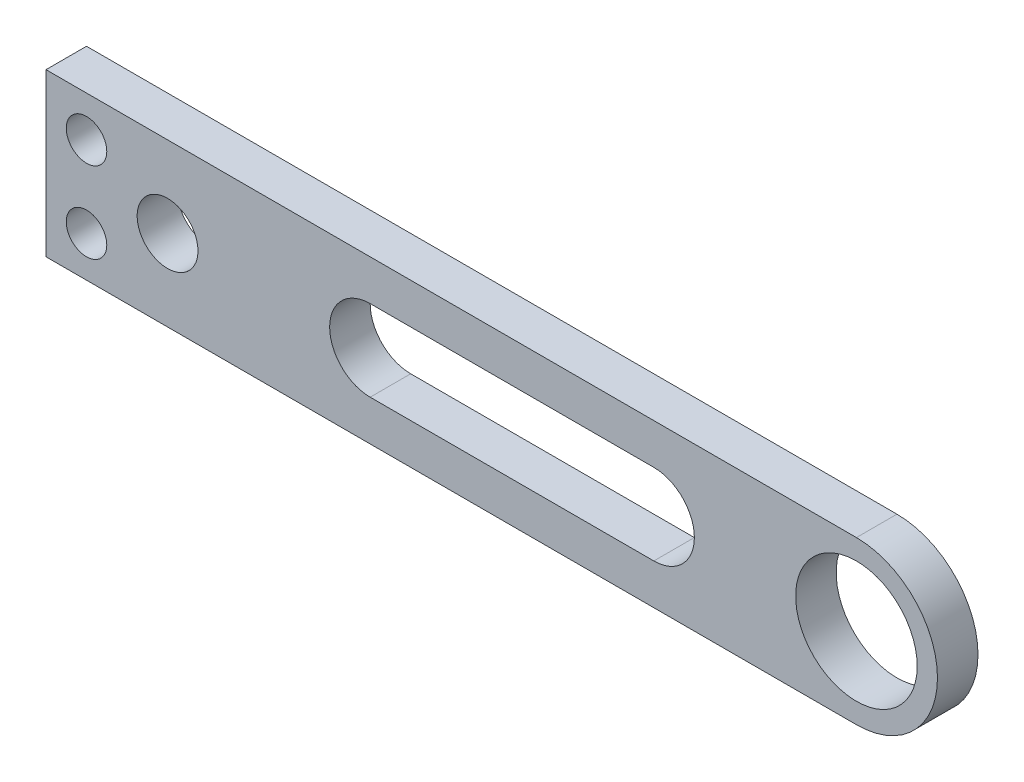
ISO-10303-21;
HEADER;
FILE_DESCRIPTION(('STEP AP214'),'2;1');
FILE_NAME('part.step','',(''),(''),'','','');
FILE_SCHEMA(('AUTOMOTIVE_DESIGN { 1 0 10303 214 1 1 1 1 }'));
ENDSEC;
DATA;
#1=APPLICATION_CONTEXT('core data for automotive mechanical design processes');
#2=APPLICATION_PROTOCOL_DEFINITION('international standard','automotive_design',2000,#1);
#3=PRODUCT_CONTEXT('',#1,'mechanical');
#4=PRODUCT('Part','Part','',(#3));
#5=PRODUCT_RELATED_PRODUCT_CATEGORY('part','',(#4));
#6=PRODUCT_DEFINITION_FORMATION('','',#4);
#7=PRODUCT_DEFINITION_CONTEXT('part definition',#1,'design');
#8=PRODUCT_DEFINITION('design','',#6,#7);
#9=PRODUCT_DEFINITION_SHAPE('','',#8);
#10=(LENGTH_UNIT() NAMED_UNIT(*) SI_UNIT(.MILLI.,.METRE.));
#11=(NAMED_UNIT(*) PLANE_ANGLE_UNIT() SI_UNIT($,.RADIAN.));
#12=(NAMED_UNIT(*) SI_UNIT($,.STERADIAN.) SOLID_ANGLE_UNIT());
#13=UNCERTAINTY_MEASURE_WITH_UNIT(LENGTH_MEASURE(1.E-05),#10,'distance_accuracy_value','');
#14=(GEOMETRIC_REPRESENTATION_CONTEXT(3) GLOBAL_UNCERTAINTY_ASSIGNED_CONTEXT((#13)) GLOBAL_UNIT_ASSIGNED_CONTEXT((#10,
#11,#12)) REPRESENTATION_CONTEXT('',''));
#15=CARTESIAN_POINT('',(0.,0.,0.));
#16=DIRECTION('',(0.,0.,1.));
#17=DIRECTION('',(1.,0.,0.));
#18=AXIS2_PLACEMENT_3D('',#15,#16,#17);
#19=CARTESIAN_POINT('',(34.,0.,2.));
#20=DIRECTION('',(0.,0.,1.));
#21=DIRECTION('',(1.,0.,0.));
#22=AXIS2_PLACEMENT_3D('',#19,#20,#21);
#23=PLANE('',#22);
#24=CARTESIAN_POINT('',(-4.,2.,2.));
#25=DIRECTION('',(0.,0.,1.));
#26=DIRECTION('',(1.,0.,0.));
#27=AXIS2_PLACEMENT_3D('',#24,#25,#26);
#28=CIRCLE('',#27,1.);
#29=CARTESIAN_POINT('',(-3.,2.,2.));
#30=VERTEX_POINT('',#29);
#31=EDGE_CURVE('E127',#30,#30,#28,.T.);
#32=ORIENTED_EDGE('',*,*,#31,.F.);
#33=EDGE_LOOP('',(#32));
#34=FACE_BOUND('',#33,.T.);
#35=CARTESIAN_POINT('',(0.,0.,2.));
#36=DIRECTION('',(0.,0.,1.));
#37=DIRECTION('',(1.,0.,0.));
#38=AXIS2_PLACEMENT_3D('',#35,#36,#37);
#39=CIRCLE('',#38,1.5);
#40=CARTESIAN_POINT('',(1.5,0.,2.));
#41=VERTEX_POINT('',#40);
#42=EDGE_CURVE('E143',#41,#41,#39,.T.);
#43=ORIENTED_EDGE('',*,*,#42,.F.);
#44=EDGE_LOOP('',(#43));
#45=FACE_BOUND('',#44,.T.);
#46=DIRECTION('',(-1.,0.,0.));
#47=VECTOR('',#46,1.);
#48=CARTESIAN_POINT('',(0.,4.,2.));
#49=LINE('',#48,#47);
#50=CARTESIAN_POINT('',(34.,4.,2.));
#51=VERTEX_POINT('',#50);
#52=CARTESIAN_POINT('',(-6.,4.,2.));
#53=VERTEX_POINT('',#52);
#54=EDGE_CURVE('E149',#51,#53,#49,.T.);
#55=ORIENTED_EDGE('',*,*,#54,.T.);
#56=DIRECTION('',(0.,-1.,0.));
#57=VECTOR('',#56,1.);
#58=CARTESIAN_POINT('',(-6.,4.,2.));
#59=LINE('',#58,#57);
#60=CARTESIAN_POINT('',(-6.,-4.,2.));
#61=VERTEX_POINT('',#60);
#62=EDGE_CURVE('E152',#53,#61,#59,.T.);
#63=ORIENTED_EDGE('',*,*,#62,.T.);
#64=DIRECTION('',(1.,0.,0.));
#65=VECTOR('',#64,1.);
#66=CARTESIAN_POINT('',(-6.,-4.,2.));
#67=LINE('',#66,#65);
#68=CARTESIAN_POINT('',(34.,-4.,2.));
#69=VERTEX_POINT('',#68);
#70=EDGE_CURVE('E155',#61,#69,#67,.T.);
#71=ORIENTED_EDGE('',*,*,#70,.T.);
#72=CARTESIAN_POINT('',(34.,0.,2.));
#73=DIRECTION('',(0.,0.,1.));
#74=DIRECTION('',(1.,0.,0.));
#75=AXIS2_PLACEMENT_3D('',#72,#73,#74);
#76=CIRCLE('',#75,4.);
#77=EDGE_CURVE('E157',#69,#51,#76,.T.);
#78=ORIENTED_EDGE('',*,*,#77,.T.);
#79=EDGE_LOOP('',(#55,#63,#71,#78));
#80=FACE_BOUND('',#79,.T.);
#81=CARTESIAN_POINT('',(34.,0.,2.));
#82=DIRECTION('',(0.,0.,1.));
#83=DIRECTION('',(1.,0.,0.));
#84=AXIS2_PLACEMENT_3D('',#81,#82,#83);
#85=CIRCLE('',#84,2.99999999999999);
#86=CARTESIAN_POINT('',(37.,0.,2.));
#87=VERTEX_POINT('',#86);
#88=EDGE_CURVE('E137',#87,#87,#85,.T.);
#89=ORIENTED_EDGE('',*,*,#88,.F.);
#90=EDGE_LOOP('',(#89));
#91=FACE_BOUND('',#90,.T.);
#92=DIRECTION('',(1.,0.,0.));
#93=VECTOR('',#92,1.);
#94=CARTESIAN_POINT('',(10.,-2.,2.));
#95=LINE('',#94,#93);
#96=CARTESIAN_POINT('',(10.,-2.,2.));
#97=VERTEX_POINT('',#96);
#98=CARTESIAN_POINT('',(24.,-2.,2.));
#99=VERTEX_POINT('',#98);
#100=EDGE_CURVE('E106',#97,#99,#95,.T.);
#101=ORIENTED_EDGE('',*,*,#100,.F.);
#102=CARTESIAN_POINT('',(10.,0.,2.));
#103=DIRECTION('',(0.,0.,1.));
#104=DIRECTION('',(1.,0.,0.));
#105=AXIS2_PLACEMENT_3D('',#102,#103,#104);
#106=CIRCLE('',#105,2.);
#107=CARTESIAN_POINT('',(10.,2.,2.));
#108=VERTEX_POINT('',#107);
#109=EDGE_CURVE('E98',#108,#97,#106,.T.);
#110=ORIENTED_EDGE('',*,*,#109,.F.);
#111=DIRECTION('',(-1.,0.,0.));
#112=VECTOR('',#111,1.);
#113=CARTESIAN_POINT('',(10.,2.,2.));
#114=LINE('',#113,#112);
#115=CARTESIAN_POINT('',(24.,2.,2.));
#116=VERTEX_POINT('',#115);
#117=EDGE_CURVE('E121',#116,#108,#114,.T.);
#118=ORIENTED_EDGE('',*,*,#117,.F.);
#119=CARTESIAN_POINT('',(24.,0.,2.));
#120=DIRECTION('',(0.,0.,1.));
#121=DIRECTION('',(1.,0.,0.));
#122=AXIS2_PLACEMENT_3D('',#119,#120,#121);
#123=CIRCLE('',#122,2.);
#124=EDGE_CURVE('E119',#99,#116,#123,.T.);
#125=ORIENTED_EDGE('',*,*,#124,.F.);
#126=EDGE_LOOP('',(#101,#110,#118,#125));
#127=FACE_BOUND('',#126,.T.);
#128=CARTESIAN_POINT('',(-4.,-2.,2.));
#129=DIRECTION('',(0.,0.,1.));
#130=DIRECTION('',(1.,0.,0.));
#131=AXIS2_PLACEMENT_3D('',#128,#129,#130);
#132=CIRCLE('',#131,1.);
#133=CARTESIAN_POINT('',(-3.,-2.,2.));
#134=VERTEX_POINT('',#133);
#135=EDGE_CURVE('E330',#134,#134,#132,.T.);
#136=ORIENTED_EDGE('',*,*,#135,.F.);
#137=EDGE_LOOP('',(#136));
#138=FACE_BOUND('',#137,.T.);
#139=ADVANCED_FACE('F33',(#34,#45,#80,#91,#127,#138),#23,.T.);
#140=CARTESIAN_POINT('',(34.,0.,0.));
#141=DIRECTION('',(0.,0.,1.));
#142=DIRECTION('',(1.,0.,0.));
#143=AXIS2_PLACEMENT_3D('',#140,#141,#142);
#144=PLANE('',#143);
#145=CARTESIAN_POINT('',(34.,0.,0.));
#146=DIRECTION('',(0.,0.,1.));
#147=DIRECTION('',(1.,0.,0.));
#148=AXIS2_PLACEMENT_3D('',#145,#146,#147);
#149=CIRCLE('',#148,2.99999999999999);
#150=CARTESIAN_POINT('',(37.,0.,0.));
#151=VERTEX_POINT('',#150);
#152=EDGE_CURVE('E114',#151,#151,#149,.T.);
#153=ORIENTED_EDGE('',*,*,#152,.T.);
#154=EDGE_LOOP('',(#153));
#155=FACE_BOUND('',#154,.T.);
#156=CARTESIAN_POINT('',(0.,0.,0.));
#157=DIRECTION('',(0.,0.,1.));
#158=DIRECTION('',(1.,0.,0.));
#159=AXIS2_PLACEMENT_3D('',#156,#157,#158);
#160=CIRCLE('',#159,1.5);
#161=CARTESIAN_POINT('',(1.5,0.,0.));
#162=VERTEX_POINT('',#161);
#163=EDGE_CURVE('E140',#162,#162,#160,.T.);
#164=ORIENTED_EDGE('',*,*,#163,.T.);
#165=EDGE_LOOP('',(#164));
#166=FACE_BOUND('',#165,.T.);
#167=DIRECTION('',(0.,-1.,0.));
#168=VECTOR('',#167,1.);
#169=CARTESIAN_POINT('',(-6.,4.,0.));
#170=LINE('',#169,#168);
#171=CARTESIAN_POINT('',(-6.,4.,0.));
#172=VERTEX_POINT('',#171);
#173=CARTESIAN_POINT('',(-6.,-4.,0.));
#174=VERTEX_POINT('',#173);
#175=EDGE_CURVE('E146',#172,#174,#170,.T.);
#176=ORIENTED_EDGE('',*,*,#175,.F.);
#177=DIRECTION('',(-1.,0.,0.));
#178=VECTOR('',#177,1.);
#179=CARTESIAN_POINT('',(0.,4.,0.));
#180=LINE('',#179,#178);
#181=CARTESIAN_POINT('',(34.,4.,0.));
#182=VERTEX_POINT('',#181);
#183=EDGE_CURVE('E153',#182,#172,#180,.T.);
#184=ORIENTED_EDGE('',*,*,#183,.F.);
#185=CARTESIAN_POINT('',(34.,0.,0.));
#186=DIRECTION('',(0.,0.,1.));
#187=DIRECTION('',(1.,0.,0.));
#188=AXIS2_PLACEMENT_3D('',#185,#186,#187);
#189=CIRCLE('',#188,4.);
#190=CARTESIAN_POINT('',(34.,-4.,0.));
#191=VERTEX_POINT('',#190);
#192=EDGE_CURVE('E165',#191,#182,#189,.T.);
#193=ORIENTED_EDGE('',*,*,#192,.F.);
#194=DIRECTION('',(1.,0.,0.));
#195=VECTOR('',#194,1.);
#196=CARTESIAN_POINT('',(0.,-4.,0.));
#197=LINE('',#196,#195);
#198=EDGE_CURVE('E163',#174,#191,#197,.T.);
#199=ORIENTED_EDGE('',*,*,#198,.F.);
#200=EDGE_LOOP('',(#176,#184,#193,#199));
#201=FACE_BOUND('',#200,.T.);
#202=CARTESIAN_POINT('',(10.,0.,0.));
#203=DIRECTION('',(0.,0.,1.));
#204=DIRECTION('',(1.,0.,0.));
#205=AXIS2_PLACEMENT_3D('',#202,#203,#204);
#206=CIRCLE('',#205,2.);
#207=CARTESIAN_POINT('',(10.,2.,0.));
#208=VERTEX_POINT('',#207);
#209=CARTESIAN_POINT('',(10.,-2.,0.));
#210=VERTEX_POINT('',#209);
#211=EDGE_CURVE('E56',#208,#210,#206,.T.);
#212=ORIENTED_EDGE('',*,*,#211,.T.);
#213=DIRECTION('',(1.,0.,0.));
#214=VECTOR('',#213,1.);
#215=CARTESIAN_POINT('',(10.,-2.,0.));
#216=LINE('',#215,#214);
#217=CARTESIAN_POINT('',(24.,-2.,0.));
#218=VERTEX_POINT('',#217);
#219=EDGE_CURVE('E113',#210,#218,#216,.T.);
#220=ORIENTED_EDGE('',*,*,#219,.T.);
#221=CARTESIAN_POINT('',(24.,0.,0.));
#222=DIRECTION('',(0.,0.,1.));
#223=DIRECTION('',(1.,0.,0.));
#224=AXIS2_PLACEMENT_3D('',#221,#222,#223);
#225=CIRCLE('',#224,2.);
#226=CARTESIAN_POINT('',(24.,2.,0.));
#227=VERTEX_POINT('',#226);
#228=EDGE_CURVE('E129',#218,#227,#225,.T.);
#229=ORIENTED_EDGE('',*,*,#228,.T.);
#230=DIRECTION('',(-1.,0.,0.));
#231=VECTOR('',#230,1.);
#232=CARTESIAN_POINT('',(10.,2.,0.));
#233=LINE('',#232,#231);
#234=EDGE_CURVE('E107',#227,#208,#233,.T.);
#235=ORIENTED_EDGE('',*,*,#234,.T.);
#236=EDGE_LOOP('',(#212,#220,#229,#235));
#237=FACE_BOUND('',#236,.T.);
#238=CARTESIAN_POINT('',(-4.,2.,0.));
#239=DIRECTION('',(0.,0.,1.));
#240=DIRECTION('',(1.,0.,0.));
#241=AXIS2_PLACEMENT_3D('',#238,#239,#240);
#242=CIRCLE('',#241,1.);
#243=CARTESIAN_POINT('',(-3.,2.,0.));
#244=VERTEX_POINT('',#243);
#245=EDGE_CURVE('E336',#244,#244,#242,.T.);
#246=ORIENTED_EDGE('',*,*,#245,.T.);
#247=EDGE_LOOP('',(#246));
#248=FACE_BOUND('',#247,.T.);
#249=CARTESIAN_POINT('',(-4.,-2.,0.));
#250=DIRECTION('',(0.,0.,1.));
#251=DIRECTION('',(1.,0.,0.));
#252=AXIS2_PLACEMENT_3D('',#249,#250,#251);
#253=CIRCLE('',#252,1.);
#254=CARTESIAN_POINT('',(-3.,-2.,0.));
#255=VERTEX_POINT('',#254);
#256=EDGE_CURVE('E333',#255,#255,#253,.T.);
#257=ORIENTED_EDGE('',*,*,#256,.T.);
#258=EDGE_LOOP('',(#257));
#259=FACE_BOUND('',#258,.T.);
#260=ADVANCED_FACE('F183',(#155,#166,#201,#237,#248,#259),#144,.F.);
#261=CARTESIAN_POINT('',(-6.,4.,2.));
#262=DIRECTION('',(1.,0.,0.));
#263=DIRECTION('',(0.,1.,0.));
#264=AXIS2_PLACEMENT_3D('',#261,#262,#263);
#265=PLANE('',#264);
#266=ORIENTED_EDGE('',*,*,#175,.T.);
#267=DIRECTION('',(0.,0.,-1.));
#268=VECTOR('',#267,1.);
#269=CARTESIAN_POINT('',(-6.,-4.,2.));
#270=LINE('',#269,#268);
#271=EDGE_CURVE('E41',#61,#174,#270,.T.);
#272=ORIENTED_EDGE('',*,*,#271,.F.);
#273=ORIENTED_EDGE('',*,*,#62,.F.);
#274=DIRECTION('',(0.,0.,-1.));
#275=VECTOR('',#274,1.);
#276=CARTESIAN_POINT('',(-6.,4.,2.));
#277=LINE('',#276,#275);
#278=EDGE_CURVE('E11',#53,#172,#277,.T.);
#279=ORIENTED_EDGE('',*,*,#278,.T.);
#280=EDGE_LOOP('',(#266,#272,#273,#279));
#281=FACE_BOUND('',#280,.T.);
#282=ADVANCED_FACE('F35',(#281),#265,.F.);
#283=CARTESIAN_POINT('',(0.,-4.,2.));
#284=DIRECTION('',(0.,1.,0.));
#285=DIRECTION('',(0.,0.,1.));
#286=AXIS2_PLACEMENT_3D('',#283,#284,#285);
#287=PLANE('',#286);
#288=ORIENTED_EDGE('',*,*,#198,.T.);
#289=DIRECTION('',(0.,0.,-1.));
#290=VECTOR('',#289,1.);
#291=CARTESIAN_POINT('',(34.,-4.,2.));
#292=LINE('',#291,#290);
#293=EDGE_CURVE('E170',#69,#191,#292,.T.);
#294=ORIENTED_EDGE('',*,*,#293,.F.);
#295=ORIENTED_EDGE('',*,*,#70,.F.);
#296=ORIENTED_EDGE('',*,*,#271,.T.);
#297=EDGE_LOOP('',(#288,#294,#295,#296));
#298=FACE_BOUND('',#297,.T.);
#299=ADVANCED_FACE('F176',(#298),#287,.F.);
#300=CARTESIAN_POINT('',(34.,0.,2.));
#301=DIRECTION('',(0.,0.,-1.));
#302=DIRECTION('',(-1.,0.,0.));
#303=AXIS2_PLACEMENT_3D('',#300,#301,#302);
#304=CYLINDRICAL_SURFACE('',#303,4.);
#305=ORIENTED_EDGE('',*,*,#192,.T.);
#306=DIRECTION('',(0.,0.,-1.));
#307=VECTOR('',#306,1.);
#308=CARTESIAN_POINT('',(34.,4.,2.));
#309=LINE('',#308,#307);
#310=EDGE_CURVE('E160',#51,#182,#309,.T.);
#311=ORIENTED_EDGE('',*,*,#310,.F.);
#312=ORIENTED_EDGE('',*,*,#77,.F.);
#313=ORIENTED_EDGE('',*,*,#293,.T.);
#314=EDGE_LOOP('',(#305,#311,#312,#313));
#315=FACE_BOUND('',#314,.T.);
#316=ADVANCED_FACE('F188',(#315),#304,.T.);
#317=CARTESIAN_POINT('',(0.,4.,2.));
#318=DIRECTION('',(0.,-1.,0.));
#319=DIRECTION('',(0.,0.,-1.));
#320=AXIS2_PLACEMENT_3D('',#317,#318,#319);
#321=PLANE('',#320);
#322=ORIENTED_EDGE('',*,*,#183,.T.);
#323=ORIENTED_EDGE('',*,*,#278,.F.);
#324=ORIENTED_EDGE('',*,*,#54,.F.);
#325=ORIENTED_EDGE('',*,*,#310,.T.);
#326=EDGE_LOOP('',(#322,#323,#324,#325));
#327=FACE_BOUND('',#326,.T.);
#328=ADVANCED_FACE('F191',(#327),#321,.F.);
#329=CARTESIAN_POINT('',(0.,0.,2.));
#330=DIRECTION('',(0.,0.,-1.));
#331=DIRECTION('',(-1.,0.,0.));
#332=AXIS2_PLACEMENT_3D('',#329,#330,#331);
#333=CYLINDRICAL_SURFACE('',#332,1.5);
#334=ORIENTED_EDGE('',*,*,#42,.T.);
#335=EDGE_LOOP('',(#334));
#336=FACE_BOUND('',#335,.T.);
#337=ORIENTED_EDGE('',*,*,#163,.F.);
#338=EDGE_LOOP('',(#337));
#339=FACE_BOUND('',#338,.T.);
#340=ADVANCED_FACE('F202',(#336,#339),#333,.F.);
#341=CARTESIAN_POINT('',(34.,0.,2.));
#342=DIRECTION('',(0.,0.,-1.));
#343=DIRECTION('',(-1.,0.,0.));
#344=AXIS2_PLACEMENT_3D('',#341,#342,#343);
#345=CYLINDRICAL_SURFACE('',#344,2.99999999999999);
#346=ORIENTED_EDGE('',*,*,#88,.T.);
#347=EDGE_LOOP('',(#346));
#348=FACE_BOUND('',#347,.T.);
#349=ORIENTED_EDGE('',*,*,#152,.F.);
#350=EDGE_LOOP('',(#349));
#351=FACE_BOUND('',#350,.T.);
#352=ADVANCED_FACE('F199',(#348,#351),#345,.F.);
#353=CARTESIAN_POINT('',(10.,0.,2.));
#354=DIRECTION('',(0.,0.,-1.));
#355=DIRECTION('',(-1.,0.,0.));
#356=AXIS2_PLACEMENT_3D('',#353,#354,#355);
#357=CYLINDRICAL_SURFACE('',#356,2.);
#358=ORIENTED_EDGE('',*,*,#211,.F.);
#359=DIRECTION('',(0.,0.,-1.));
#360=VECTOR('',#359,1.);
#361=CARTESIAN_POINT('',(10.,2.,2.));
#362=LINE('',#361,#360);
#363=EDGE_CURVE('E102',#108,#208,#362,.T.);
#364=ORIENTED_EDGE('',*,*,#363,.F.);
#365=ORIENTED_EDGE('',*,*,#109,.T.);
#366=DIRECTION('',(0.,0.,-1.));
#367=VECTOR('',#366,1.);
#368=CARTESIAN_POINT('',(10.,-2.,2.));
#369=LINE('',#368,#367);
#370=EDGE_CURVE('E101',#97,#210,#369,.T.);
#371=ORIENTED_EDGE('',*,*,#370,.T.);
#372=EDGE_LOOP('',(#358,#364,#365,#371));
#373=FACE_BOUND('',#372,.T.);
#374=ADVANCED_FACE('F100',(#373),#357,.F.);
#375=CARTESIAN_POINT('',(10.,-2.,2.));
#376=DIRECTION('',(0.,1.,0.));
#377=DIRECTION('',(0.,0.,1.));
#378=AXIS2_PLACEMENT_3D('',#375,#376,#377);
#379=PLANE('',#378);
#380=ORIENTED_EDGE('',*,*,#219,.F.);
#381=ORIENTED_EDGE('',*,*,#370,.F.);
#382=ORIENTED_EDGE('',*,*,#100,.T.);
#383=DIRECTION('',(0.,0.,-1.));
#384=VECTOR('',#383,1.);
#385=CARTESIAN_POINT('',(24.,-2.,2.));
#386=LINE('',#385,#384);
#387=EDGE_CURVE('E115',#99,#218,#386,.T.);
#388=ORIENTED_EDGE('',*,*,#387,.T.);
#389=EDGE_LOOP('',(#380,#381,#382,#388));
#390=FACE_BOUND('',#389,.T.);
#391=ADVANCED_FACE('F110',(#390),#379,.T.);
#392=CARTESIAN_POINT('',(24.,0.,2.));
#393=DIRECTION('',(0.,0.,-1.));
#394=DIRECTION('',(-1.,0.,0.));
#395=AXIS2_PLACEMENT_3D('',#392,#393,#394);
#396=CYLINDRICAL_SURFACE('',#395,2.);
#397=ORIENTED_EDGE('',*,*,#228,.F.);
#398=ORIENTED_EDGE('',*,*,#387,.F.);
#399=ORIENTED_EDGE('',*,*,#124,.T.);
#400=DIRECTION('',(0.,0.,-1.));
#401=VECTOR('',#400,1.);
#402=CARTESIAN_POINT('',(24.,2.,2.));
#403=LINE('',#402,#401);
#404=EDGE_CURVE('E48',#116,#227,#403,.T.);
#405=ORIENTED_EDGE('',*,*,#404,.T.);
#406=EDGE_LOOP('',(#397,#398,#399,#405));
#407=FACE_BOUND('',#406,.T.);
#408=ADVANCED_FACE('F284',(#407),#396,.F.);
#409=CARTESIAN_POINT('',(10.,2.,2.));
#410=DIRECTION('',(0.,-1.,0.));
#411=DIRECTION('',(0.,0.,-1.));
#412=AXIS2_PLACEMENT_3D('',#409,#410,#411);
#413=PLANE('',#412);
#414=ORIENTED_EDGE('',*,*,#234,.F.);
#415=ORIENTED_EDGE('',*,*,#404,.F.);
#416=ORIENTED_EDGE('',*,*,#117,.T.);
#417=ORIENTED_EDGE('',*,*,#363,.T.);
#418=EDGE_LOOP('',(#414,#415,#416,#417));
#419=FACE_BOUND('',#418,.T.);
#420=ADVANCED_FACE('F292',(#419),#413,.T.);
#421=CARTESIAN_POINT('',(-4.,2.,2.));
#422=DIRECTION('',(0.,0.,-1.));
#423=DIRECTION('',(-1.,0.,0.));
#424=AXIS2_PLACEMENT_3D('',#421,#422,#423);
#425=CYLINDRICAL_SURFACE('',#424,1.);
#426=ORIENTED_EDGE('',*,*,#31,.T.);
#427=EDGE_LOOP('',(#426));
#428=FACE_BOUND('',#427,.T.);
#429=ORIENTED_EDGE('',*,*,#245,.F.);
#430=EDGE_LOOP('',(#429));
#431=FACE_BOUND('',#430,.T.);
#432=ADVANCED_FACE('F301',(#428,#431),#425,.F.);
#433=CARTESIAN_POINT('',(-4.,-2.,2.));
#434=DIRECTION('',(0.,0.,-1.));
#435=DIRECTION('',(-1.,0.,0.));
#436=AXIS2_PLACEMENT_3D('',#433,#434,#435);
#437=CYLINDRICAL_SURFACE('',#436,1.);
#438=ORIENTED_EDGE('',*,*,#135,.T.);
#439=EDGE_LOOP('',(#438));
#440=FACE_BOUND('',#439,.T.);
#441=ORIENTED_EDGE('',*,*,#256,.F.);
#442=EDGE_LOOP('',(#441));
#443=FACE_BOUND('',#442,.T.);
#444=ADVANCED_FACE('F309',(#440,#443),#437,.F.);
#445=CLOSED_SHELL('',(#139,#260,#282,#299,#316,#328,#340,#352,#374,#391,#408,#420,#432,#444));
#446=MANIFOLD_SOLID_BREP('B2',#445);
#447=ADVANCED_BREP_SHAPE_REPRESENTATION('',(#18,#446),#14);
#448=SHAPE_DEFINITION_REPRESENTATION(#9,#447);
ENDSEC;
END-ISO-10303-21;
